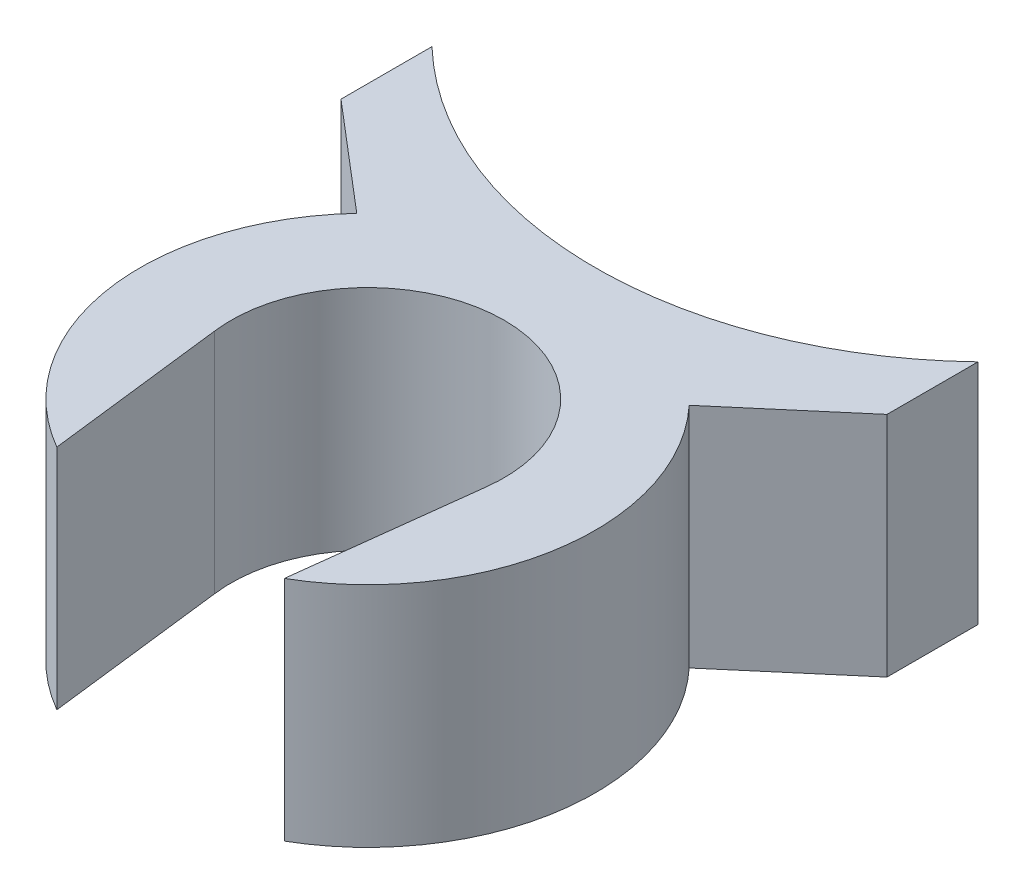
ISO-10303-21;
HEADER;
FILE_DESCRIPTION(('STEP AP214'),'2;1');
FILE_NAME('part.step','',(''),(''),'','','');
FILE_SCHEMA(('AUTOMOTIVE_DESIGN { 1 0 10303 214 1 1 1 1 }'));
ENDSEC;
DATA;
#1=APPLICATION_CONTEXT('core data for automotive mechanical design processes');
#2=APPLICATION_PROTOCOL_DEFINITION('international standard','automotive_design',2000,#1);
#3=PRODUCT_CONTEXT('',#1,'mechanical');
#4=PRODUCT('Part','Part','',(#3));
#5=PRODUCT_RELATED_PRODUCT_CATEGORY('part','',(#4));
#6=PRODUCT_DEFINITION_FORMATION('','',#4);
#7=PRODUCT_DEFINITION_CONTEXT('part definition',#1,'design');
#8=PRODUCT_DEFINITION('design','',#6,#7);
#9=PRODUCT_DEFINITION_SHAPE('','',#8);
#10=(LENGTH_UNIT() NAMED_UNIT(*) SI_UNIT(.MILLI.,.METRE.));
#11=(NAMED_UNIT(*) PLANE_ANGLE_UNIT() SI_UNIT($,.RADIAN.));
#12=(NAMED_UNIT(*) SI_UNIT($,.STERADIAN.) SOLID_ANGLE_UNIT());
#13=UNCERTAINTY_MEASURE_WITH_UNIT(LENGTH_MEASURE(1.E-05),#10,'distance_accuracy_value','');
#14=(GEOMETRIC_REPRESENTATION_CONTEXT(3) GLOBAL_UNCERTAINTY_ASSIGNED_CONTEXT((#13)) GLOBAL_UNIT_ASSIGNED_CONTEXT((#10,
#11,#12)) REPRESENTATION_CONTEXT('',''));
#15=CARTESIAN_POINT('',(0.,0.,0.));
#16=DIRECTION('',(0.,0.,1.));
#17=DIRECTION('',(1.,0.,0.));
#18=AXIS2_PLACEMENT_3D('',#15,#16,#17);
#19=CARTESIAN_POINT('',(0.,5.,0.));
#20=DIRECTION('',(0.,-1.,0.));
#21=DIRECTION('',(0.,0.,-1.));
#22=AXIS2_PLACEMENT_3D('',#19,#20,#21);
#23=CYLINDRICAL_SURFACE('',#22,5.);
#24=DIRECTION('',(0.,1.,0.));
#25=VECTOR('',#24,1.);
#26=CARTESIAN_POINT('',(-2.5,-5.,4.33012701892219));
#27=LINE('',#26,#25);
#28=CARTESIAN_POINT('',(-2.5,0.,4.33012701892219));
#29=VERTEX_POINT('',#28);
#30=CARTESIAN_POINT('',(-2.5,5.,4.33012701892219));
#31=VERTEX_POINT('',#30);
#32=EDGE_CURVE('E233',#29,#31,#27,.T.);
#33=ORIENTED_EDGE('',*,*,#32,.T.);
#34=CARTESIAN_POINT('',(0.,5.,0.));
#35=DIRECTION('',(0.,1.,0.));
#36=DIRECTION('',(0.,0.,1.));
#37=AXIS2_PLACEMENT_3D('',#34,#35,#36);
#38=CIRCLE('',#37,5.);
#39=CARTESIAN_POINT('',(-3.65307531447136,5.,-3.41394797072245));
#40=VERTEX_POINT('',#39);
#41=EDGE_CURVE('E137',#40,#31,#38,.T.);
#42=ORIENTED_EDGE('',*,*,#41,.F.);
#43=DIRECTION('',(0.,-1.,0.));
#44=VECTOR('',#43,1.);
#45=CARTESIAN_POINT('',(-3.65307531447136,5.,-3.41394797072245));
#46=LINE('',#45,#44);
#47=CARTESIAN_POINT('',(-3.65307531447136,0.,-3.41394797072245));
#48=VERTEX_POINT('',#47);
#49=EDGE_CURVE('E167',#40,#48,#46,.T.);
#50=ORIENTED_EDGE('',*,*,#49,.T.);
#51=CARTESIAN_POINT('',(0.,0.,0.));
#52=DIRECTION('',(0.,1.,0.));
#53=DIRECTION('',(0.,0.,1.));
#54=AXIS2_PLACEMENT_3D('',#51,#52,#53);
#55=CIRCLE('',#54,5.);
#56=EDGE_CURVE('E157',#48,#29,#55,.T.);
#57=ORIENTED_EDGE('',*,*,#56,.T.);
#58=EDGE_LOOP('',(#33,#42,#50,#57));
#59=FACE_BOUND('',#58,.T.);
#60=ADVANCED_FACE('F39',(#59),#23,.T.);
#61=CARTESIAN_POINT('',(0.,5.,-13.6636384281383));
#62=DIRECTION('',(0.,1.,0.));
#63=DIRECTION('',(0.,0.,1.));
#64=AXIS2_PLACEMENT_3D('',#61,#62,#63);
#65=PLANE('',#64);
#66=DIRECTION('',(-0.761120289770479,0.,0.648610749602335));
#67=VECTOR('',#66,1.);
#68=CARTESIAN_POINT('',(3.65307531447136,5.,-3.41394797072246));
#69=LINE('',#68,#67);
#70=CARTESIAN_POINT('',(6.,5.,-5.41394797072245));
#71=VERTEX_POINT('',#70);
#72=CARTESIAN_POINT('',(3.65307531447136,5.,-3.41394797072246));
#73=VERTEX_POINT('',#72);
#74=EDGE_CURVE('E115',#71,#73,#69,.T.);
#75=ORIENTED_EDGE('',*,*,#74,.F.);
#76=DIRECTION('',(0.,0.,-1.));
#77=VECTOR('',#76,1.);
#78=CARTESIAN_POINT('',(6.,5.,-7.41394797072245));
#79=LINE('',#78,#77);
#80=CARTESIAN_POINT('',(6.,5.,-7.41394797072245));
#81=VERTEX_POINT('',#80);
#82=EDGE_CURVE('E123',#71,#81,#79,.T.);
#83=ORIENTED_EDGE('',*,*,#82,.T.);
#84=CARTESIAN_POINT('',(0.,5.,-13.6636384281383));
#85=DIRECTION('',(0.,-1.,0.));
#86=DIRECTION('',(0.,0.,1.));
#87=AXIS2_PLACEMENT_3D('',#84,#85,#86);
#88=CIRCLE('',#87,8.66363842813831);
#89=CARTESIAN_POINT('',(-6.,5.,-7.41394797072245));
#90=VERTEX_POINT('',#89);
#91=EDGE_CURVE('E163',#81,#90,#88,.T.);
#92=ORIENTED_EDGE('',*,*,#91,.T.);
#93=DIRECTION('',(0.,0.,1.));
#94=VECTOR('',#93,1.);
#95=CARTESIAN_POINT('',(-6.,5.,-7.41394797072245));
#96=LINE('',#95,#94);
#97=CARTESIAN_POINT('',(-6.,5.,-5.41394797072245));
#98=VERTEX_POINT('',#97);
#99=EDGE_CURVE('E204',#90,#98,#96,.T.);
#100=ORIENTED_EDGE('',*,*,#99,.T.);
#101=DIRECTION('',(-0.761120289770478,0.,-0.648610749602336));
#102=VECTOR('',#101,1.);
#103=CARTESIAN_POINT('',(-3.65307531447136,5.,-3.41394797072245));
#104=LINE('',#103,#102);
#105=EDGE_CURVE('E209',#40,#98,#104,.T.);
#106=ORIENTED_EDGE('',*,*,#105,.F.);
#107=ORIENTED_EDGE('',*,*,#41,.T.);
#108=DIRECTION('',(-0.119580915949593,0.,-0.992824458069329));
#109=VECTOR('',#108,1.);
#110=CARTESIAN_POINT('',(-2.97833606685758,5.,0.358726209840881));
#111=LINE('',#110,#109);
#112=CARTESIAN_POINT('',(-2.97489143229235,5.,0.387325400759562));
#113=VERTEX_POINT('',#112);
#114=EDGE_CURVE('E227',#31,#113,#111,.T.);
#115=ORIENTED_EDGE('',*,*,#114,.T.);
#116=CARTESIAN_POINT('',(0.,5.,0.));
#117=DIRECTION('',(0.,1.,0.));
#118=DIRECTION('',(0.,0.,1.));
#119=AXIS2_PLACEMENT_3D('',#116,#117,#118);
#120=CIRCLE('',#119,3.);
#121=CARTESIAN_POINT('',(2.97489143229235,5.,0.387325400759561));
#122=VERTEX_POINT('',#121);
#123=EDGE_CURVE('E152',#122,#113,#120,.T.);
#124=ORIENTED_EDGE('',*,*,#123,.F.);
#125=DIRECTION('',(0.119580915949592,0.,-0.992824458069329));
#126=VECTOR('',#125,1.);
#127=CARTESIAN_POINT('',(2.97833606685758,5.,0.35872620984088));
#128=LINE('',#127,#126);
#129=CARTESIAN_POINT('',(2.5,5.,4.33012701892219));
#130=VERTEX_POINT('',#129);
#131=EDGE_CURVE('E184',#130,#122,#128,.T.);
#132=ORIENTED_EDGE('',*,*,#131,.F.);
#133=EDGE_CURVE('E127',#130,#73,#38,.T.);
#134=ORIENTED_EDGE('',*,*,#133,.T.);
#135=EDGE_LOOP('',(#75,#83,#92,#100,#106,#107,#115,#124,#132,#134));
#136=FACE_BOUND('',#135,.T.);
#137=ADVANCED_FACE('F121',(#136),#65,.T.);
#138=CARTESIAN_POINT('',(0.,0.,-13.6636384281383));
#139=DIRECTION('',(0.,1.,0.));
#140=DIRECTION('',(0.,0.,1.));
#141=AXIS2_PLACEMENT_3D('',#138,#139,#140);
#142=PLANE('',#141);
#143=DIRECTION('',(0.,0.,-1.));
#144=VECTOR('',#143,1.);
#145=CARTESIAN_POINT('',(6.,0.,-7.41394797072245));
#146=LINE('',#145,#144);
#147=CARTESIAN_POINT('',(6.,0.,-5.41394797072245));
#148=VERTEX_POINT('',#147);
#149=CARTESIAN_POINT('',(6.,0.,-7.41394797072245));
#150=VERTEX_POINT('',#149);
#151=EDGE_CURVE('E161',#148,#150,#146,.T.);
#152=ORIENTED_EDGE('',*,*,#151,.F.);
#153=DIRECTION('',(-0.761120289770479,0.,0.648610749602335));
#154=VECTOR('',#153,1.);
#155=CARTESIAN_POINT('',(6.59680672876855,0.,-5.92253414943412));
#156=LINE('',#155,#154);
#157=CARTESIAN_POINT('',(3.65307531447136,0.,-3.41394797072246));
#158=VERTEX_POINT('',#157);
#159=EDGE_CURVE('E55',#148,#158,#156,.T.);
#160=ORIENTED_EDGE('',*,*,#159,.T.);
#161=CARTESIAN_POINT('',(2.5,0.,4.33012701892219));
#162=VERTEX_POINT('',#161);
#163=EDGE_CURVE('E156',#162,#158,#55,.T.);
#164=ORIENTED_EDGE('',*,*,#163,.F.);
#165=DIRECTION('',(0.119580915949592,0.,-0.992824458069329));
#166=VECTOR('',#165,1.);
#167=CARTESIAN_POINT('',(4.60052227272344,0.,-13.1095277162723));
#168=LINE('',#167,#166);
#169=CARTESIAN_POINT('',(2.97489143229235,0.,0.387325400759561));
#170=VERTEX_POINT('',#169);
#171=EDGE_CURVE('E182',#162,#170,#168,.T.);
#172=ORIENTED_EDGE('',*,*,#171,.T.);
#173=CARTESIAN_POINT('',(0.,0.,0.));
#174=DIRECTION('',(0.,1.,0.));
#175=DIRECTION('',(0.,0.,1.));
#176=AXIS2_PLACEMENT_3D('',#173,#174,#175);
#177=CIRCLE('',#176,3.);
#178=CARTESIAN_POINT('',(-2.97489143229235,0.,0.387325400759562));
#179=VERTEX_POINT('',#178);
#180=EDGE_CURVE('E193',#170,#179,#177,.T.);
#181=ORIENTED_EDGE('',*,*,#180,.T.);
#182=DIRECTION('',(-0.119580915949593,0.,-0.992824458069329));
#183=VECTOR('',#182,1.);
#184=CARTESIAN_POINT('',(-4.60052227272344,0.,-13.1095277162723));
#185=LINE('',#184,#183);
#186=EDGE_CURVE('E62',#29,#179,#185,.T.);
#187=ORIENTED_EDGE('',*,*,#186,.F.);
#188=ORIENTED_EDGE('',*,*,#56,.F.);
#189=DIRECTION('',(-0.761120289770478,0.,-0.648610749602336));
#190=VECTOR('',#189,1.);
#191=CARTESIAN_POINT('',(-6.59680672876856,0.,-5.92253414943413));
#192=LINE('',#191,#190);
#193=CARTESIAN_POINT('',(-6.,0.,-5.41394797072245));
#194=VERTEX_POINT('',#193);
#195=EDGE_CURVE('E224',#48,#194,#192,.T.);
#196=ORIENTED_EDGE('',*,*,#195,.T.);
#197=DIRECTION('',(0.,0.,1.));
#198=VECTOR('',#197,1.);
#199=CARTESIAN_POINT('',(-6.,0.,-7.41394797072245));
#200=LINE('',#199,#198);
#201=CARTESIAN_POINT('',(-6.,0.,-7.41394797072245));
#202=VERTEX_POINT('',#201);
#203=EDGE_CURVE('E151',#202,#194,#200,.T.);
#204=ORIENTED_EDGE('',*,*,#203,.F.);
#205=CARTESIAN_POINT('',(0.,0.,-13.6636384281383));
#206=DIRECTION('',(0.,-1.,0.));
#207=DIRECTION('',(0.,0.,1.));
#208=AXIS2_PLACEMENT_3D('',#205,#206,#207);
#209=CIRCLE('',#208,8.66363842813831);
#210=EDGE_CURVE('E147',#150,#202,#209,.T.);
#211=ORIENTED_EDGE('',*,*,#210,.F.);
#212=EDGE_LOOP('',(#152,#160,#164,#172,#181,#187,#188,#196,#204,#211));
#213=FACE_BOUND('',#212,.T.);
#214=ADVANCED_FACE('F192',(#213),#142,.F.);
#215=CARTESIAN_POINT('',(0.,5.,-13.6636384281383));
#216=DIRECTION('',(0.,-1.,0.));
#217=DIRECTION('',(0.,0.,-1.));
#218=AXIS2_PLACEMENT_3D('',#215,#216,#217);
#219=CYLINDRICAL_SURFACE('',#218,8.66363842813831);
#220=ORIENTED_EDGE('',*,*,#210,.T.);
#221=DIRECTION('',(0.,-1.,0.));
#222=VECTOR('',#221,1.);
#223=CARTESIAN_POINT('',(-6.,5.,-7.41394797072245));
#224=LINE('',#223,#222);
#225=EDGE_CURVE('E171',#90,#202,#224,.T.);
#226=ORIENTED_EDGE('',*,*,#225,.F.);
#227=ORIENTED_EDGE('',*,*,#91,.F.);
#228=DIRECTION('',(0.,-1.,0.));
#229=VECTOR('',#228,1.);
#230=CARTESIAN_POINT('',(6.,5.,-7.41394797072245));
#231=LINE('',#230,#229);
#232=EDGE_CURVE('E134',#81,#150,#231,.T.);
#233=ORIENTED_EDGE('',*,*,#232,.T.);
#234=EDGE_LOOP('',(#220,#226,#227,#233));
#235=FACE_BOUND('',#234,.T.);
#236=ADVANCED_FACE('F41',(#235),#219,.F.);
#237=CARTESIAN_POINT('',(-6.,5.,-7.41394797072245));
#238=DIRECTION('',(1.,0.,0.));
#239=DIRECTION('',(0.,0.,-1.));
#240=AXIS2_PLACEMENT_3D('',#237,#238,#239);
#241=PLANE('',#240);
#242=ORIENTED_EDGE('',*,*,#203,.T.);
#243=DIRECTION('',(0.,1.,0.));
#244=VECTOR('',#243,1.);
#245=CARTESIAN_POINT('',(-6.,-5.,-5.41394797072245));
#246=LINE('',#245,#244);
#247=EDGE_CURVE('E130',#194,#98,#246,.T.);
#248=ORIENTED_EDGE('',*,*,#247,.T.);
#249=ORIENTED_EDGE('',*,*,#99,.F.);
#250=ORIENTED_EDGE('',*,*,#225,.T.);
#251=EDGE_LOOP('',(#242,#248,#249,#250));
#252=FACE_BOUND('',#251,.T.);
#253=ADVANCED_FACE('F214',(#252),#241,.F.);
#254=ORIENTED_EDGE('',*,*,#133,.F.);
#255=DIRECTION('',(0.,1.,0.));
#256=VECTOR('',#255,1.);
#257=CARTESIAN_POINT('',(2.5,-5.,4.33012701892219));
#258=LINE('',#257,#256);
#259=EDGE_CURVE('E234',#162,#130,#258,.T.);
#260=ORIENTED_EDGE('',*,*,#259,.F.);
#261=ORIENTED_EDGE('',*,*,#163,.T.);
#262=DIRECTION('',(0.,-1.,0.));
#263=VECTOR('',#262,1.);
#264=CARTESIAN_POINT('',(3.65307531447136,5.,-3.41394797072246));
#265=LINE('',#264,#263);
#266=EDGE_CURVE('E141',#73,#158,#265,.T.);
#267=ORIENTED_EDGE('',*,*,#266,.F.);
#268=EDGE_LOOP('',(#254,#260,#261,#267));
#269=FACE_BOUND('',#268,.T.);
#270=ADVANCED_FACE('F254',(#269),#23,.T.);
#271=CARTESIAN_POINT('',(6.,5.,-7.41394797072245));
#272=DIRECTION('',(-1.,0.,0.));
#273=DIRECTION('',(0.,0.,1.));
#274=AXIS2_PLACEMENT_3D('',#271,#272,#273);
#275=PLANE('',#274);
#276=ORIENTED_EDGE('',*,*,#82,.F.);
#277=DIRECTION('',(0.,-1.,0.));
#278=VECTOR('',#277,1.);
#279=CARTESIAN_POINT('',(6.,5.,-5.41394797072245));
#280=LINE('',#279,#278);
#281=EDGE_CURVE('E11',#71,#148,#280,.T.);
#282=ORIENTED_EDGE('',*,*,#281,.T.);
#283=ORIENTED_EDGE('',*,*,#151,.T.);
#284=ORIENTED_EDGE('',*,*,#232,.F.);
#285=EDGE_LOOP('',(#276,#282,#283,#284));
#286=FACE_BOUND('',#285,.T.);
#287=ADVANCED_FACE('F132',(#286),#275,.F.);
#288=CARTESIAN_POINT('',(0.,5.,0.));
#289=DIRECTION('',(0.,-1.,0.));
#290=DIRECTION('',(0.,0.,-1.));
#291=AXIS2_PLACEMENT_3D('',#288,#289,#290);
#292=CYLINDRICAL_SURFACE('',#291,3.);
#293=DIRECTION('',(0.,-1.,0.));
#294=VECTOR('',#293,1.);
#295=CARTESIAN_POINT('',(2.97489143229236,5.,0.387325400759503));
#296=LINE('',#295,#294);
#297=EDGE_CURVE('E48',#122,#170,#296,.T.);
#298=ORIENTED_EDGE('',*,*,#297,.F.);
#299=ORIENTED_EDGE('',*,*,#123,.T.);
#300=DIRECTION('',(0.,-1.,0.));
#301=VECTOR('',#300,1.);
#302=CARTESIAN_POINT('',(-2.97489143229235,5.,0.387325400759562));
#303=LINE('',#302,#301);
#304=EDGE_CURVE('E175',#113,#179,#303,.T.);
#305=ORIENTED_EDGE('',*,*,#304,.T.);
#306=ORIENTED_EDGE('',*,*,#180,.F.);
#307=EDGE_LOOP('',(#298,#299,#305,#306));
#308=FACE_BOUND('',#307,.T.);
#309=ADVANCED_FACE('F197',(#308),#292,.F.);
#310=CARTESIAN_POINT('',(-2.97833606685758,-5.,0.358726209840881));
#311=DIRECTION('',(0.992824458069329,0.,-0.119580915949593));
#312=DIRECTION('',(-0.119580915949593,0.,-0.992824458069329));
#313=AXIS2_PLACEMENT_3D('',#310,#311,#312);
#314=PLANE('',#313);
#315=ORIENTED_EDGE('',*,*,#186,.T.);
#316=ORIENTED_EDGE('',*,*,#304,.F.);
#317=ORIENTED_EDGE('',*,*,#114,.F.);
#318=ORIENTED_EDGE('',*,*,#32,.F.);
#319=EDGE_LOOP('',(#315,#316,#317,#318));
#320=FACE_BOUND('',#319,.T.);
#321=ADVANCED_FACE('F243',(#320),#314,.T.);
#322=CARTESIAN_POINT('',(2.97833606685758,-5.,0.35872620984088));
#323=DIRECTION('',(0.992824458069329,0.,0.119580915949592));
#324=DIRECTION('',(0.119580915949592,0.,-0.992824458069329));
#325=AXIS2_PLACEMENT_3D('',#322,#323,#324);
#326=PLANE('',#325);
#327=ORIENTED_EDGE('',*,*,#259,.T.);
#328=ORIENTED_EDGE('',*,*,#131,.T.);
#329=ORIENTED_EDGE('',*,*,#297,.T.);
#330=ORIENTED_EDGE('',*,*,#171,.F.);
#331=EDGE_LOOP('',(#327,#328,#329,#330));
#332=FACE_BOUND('',#331,.T.);
#333=ADVANCED_FACE('F181',(#332),#326,.F.);
#334=CARTESIAN_POINT('',(3.65307531447136,-5.,-3.41394797072246));
#335=DIRECTION('',(-0.648610749602335,0.,-0.761120289770479));
#336=DIRECTION('',(-0.761120289770479,0.,0.648610749602335));
#337=AXIS2_PLACEMENT_3D('',#334,#335,#336);
#338=PLANE('',#337);
#339=ORIENTED_EDGE('',*,*,#281,.F.);
#340=ORIENTED_EDGE('',*,*,#74,.T.);
#341=ORIENTED_EDGE('',*,*,#266,.T.);
#342=ORIENTED_EDGE('',*,*,#159,.F.);
#343=EDGE_LOOP('',(#339,#340,#341,#342));
#344=FACE_BOUND('',#343,.T.);
#345=ADVANCED_FACE('F114',(#344),#338,.F.);
#346=CARTESIAN_POINT('',(-3.65307531447136,-5.,-3.41394797072245));
#347=DIRECTION('',(0.648610749602336,0.,-0.761120289770478));
#348=DIRECTION('',(-0.761120289770478,0.,-0.648610749602336));
#349=AXIS2_PLACEMENT_3D('',#346,#347,#348);
#350=PLANE('',#349);
#351=ORIENTED_EDGE('',*,*,#49,.F.);
#352=ORIENTED_EDGE('',*,*,#105,.T.);
#353=ORIENTED_EDGE('',*,*,#247,.F.);
#354=ORIENTED_EDGE('',*,*,#195,.F.);
#355=EDGE_LOOP('',(#351,#352,#353,#354));
#356=FACE_BOUND('',#355,.T.);
#357=ADVANCED_FACE('F329',(#356),#350,.F.);
#358=CLOSED_SHELL('',(#60,#137,#214,#236,#253,#270,#287,#309,#321,#333,#345,#357));
#359=MANIFOLD_SOLID_BREP('B2',#358);
#360=ADVANCED_BREP_SHAPE_REPRESENTATION('',(#18,#359),#14);
#361=SHAPE_DEFINITION_REPRESENTATION(#9,#360);
ENDSEC;
END-ISO-10303-21;
